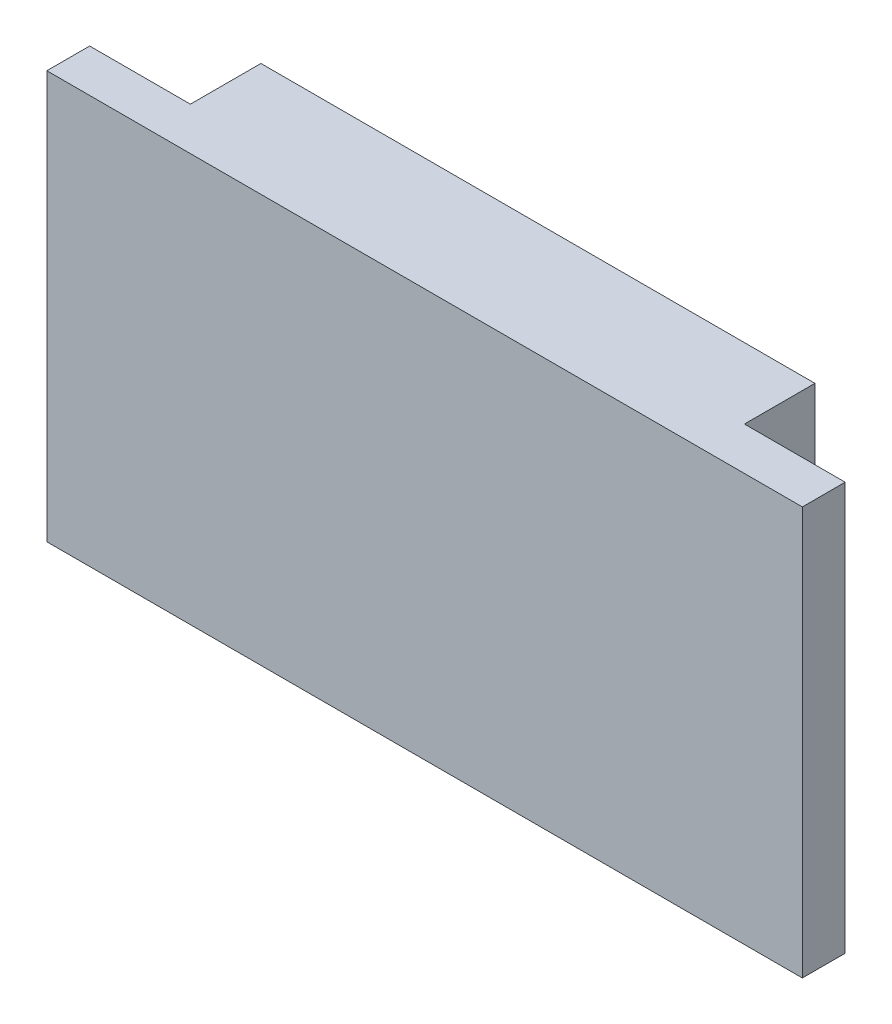
ISO-10303-21;
HEADER;
FILE_DESCRIPTION(('STEP AP214'),'2;1');
FILE_NAME('part.step','',(''),(''),'','','');
FILE_SCHEMA(('AUTOMOTIVE_DESIGN { 1 0 10303 214 1 1 1 1 }'));
ENDSEC;
DATA;
#1=APPLICATION_CONTEXT('core data for automotive mechanical design processes');
#2=APPLICATION_PROTOCOL_DEFINITION('international standard','automotive_design',2000,#1);
#3=PRODUCT_CONTEXT('',#1,'mechanical');
#4=PRODUCT('Part','Part','',(#3));
#5=PRODUCT_RELATED_PRODUCT_CATEGORY('part','',(#4));
#6=PRODUCT_DEFINITION_FORMATION('','',#4);
#7=PRODUCT_DEFINITION_CONTEXT('part definition',#1,'design');
#8=PRODUCT_DEFINITION('design','',#6,#7);
#9=PRODUCT_DEFINITION_SHAPE('','',#8);
#10=(LENGTH_UNIT() NAMED_UNIT(*) SI_UNIT(.MILLI.,.METRE.));
#11=(NAMED_UNIT(*) PLANE_ANGLE_UNIT() SI_UNIT($,.RADIAN.));
#12=(NAMED_UNIT(*) SI_UNIT($,.STERADIAN.) SOLID_ANGLE_UNIT());
#13=UNCERTAINTY_MEASURE_WITH_UNIT(LENGTH_MEASURE(1.E-05),#10,'distance_accuracy_value','');
#14=(GEOMETRIC_REPRESENTATION_CONTEXT(3) GLOBAL_UNCERTAINTY_ASSIGNED_CONTEXT((#13)) GLOBAL_UNIT_ASSIGNED_CONTEXT((#10,
#11,#12)) REPRESENTATION_CONTEXT('',''));
#15=CARTESIAN_POINT('',(0.,0.,0.));
#16=DIRECTION('',(0.,0.,1.));
#17=DIRECTION('',(1.,0.,0.));
#18=AXIS2_PLACEMENT_3D('',#15,#16,#17);
#19=CARTESIAN_POINT('',(-15.,-8.1,4.5));
#20=DIRECTION('',(-1.,0.,0.));
#21=DIRECTION('',(0.,0.,1.));
#22=AXIS2_PLACEMENT_3D('',#19,#20,#21);
#23=PLANE('',#22);
#24=DIRECTION('',(0.,0.,-1.));
#25=VECTOR('',#24,1.);
#26=CARTESIAN_POINT('',(-15.,8.1,4.5));
#27=LINE('',#26,#25);
#28=CARTESIAN_POINT('',(-15.,8.1,4.5));
#29=VERTEX_POINT('',#28);
#30=CARTESIAN_POINT('',(-15.,8.1,2.8));
#31=VERTEX_POINT('',#30);
#32=EDGE_CURVE('E47',#29,#31,#27,.T.);
#33=ORIENTED_EDGE('',*,*,#32,.T.);
#34=DIRECTION('',(0.,-1.,0.));
#35=VECTOR('',#34,1.);
#36=CARTESIAN_POINT('',(-15.,-8.1,2.8));
#37=LINE('',#36,#35);
#38=CARTESIAN_POINT('',(-15.,-8.1,2.8));
#39=VERTEX_POINT('',#38);
#40=EDGE_CURVE('E165',#31,#39,#37,.T.);
#41=ORIENTED_EDGE('',*,*,#40,.T.);
#42=DIRECTION('',(0.,0.,-1.));
#43=VECTOR('',#42,1.);
#44=CARTESIAN_POINT('',(-15.,-8.1,4.5));
#45=LINE('',#44,#43);
#46=CARTESIAN_POINT('',(-15.,-8.1,4.5));
#47=VERTEX_POINT('',#46);
#48=EDGE_CURVE('E13',#47,#39,#45,.T.);
#49=ORIENTED_EDGE('',*,*,#48,.F.);
#50=DIRECTION('',(0.,1.,0.));
#51=VECTOR('',#50,1.);
#52=CARTESIAN_POINT('',(-15.,-8.1,4.5));
#53=LINE('',#52,#51);
#54=EDGE_CURVE('E131',#47,#29,#53,.T.);
#55=ORIENTED_EDGE('',*,*,#54,.T.);
#56=EDGE_LOOP('',(#33,#41,#49,#55));
#57=FACE_BOUND('',#56,.T.);
#58=ADVANCED_FACE('F44',(#57),#23,.T.);
#59=CARTESIAN_POINT('',(15.,-8.1,4.5));
#60=DIRECTION('',(-1.,0.,0.));
#61=DIRECTION('',(0.,0.,1.));
#62=AXIS2_PLACEMENT_3D('',#59,#60,#61);
#63=PLANE('',#62);
#64=DIRECTION('',(0.,1.,0.));
#65=VECTOR('',#64,1.);
#66=CARTESIAN_POINT('',(15.,8.1,2.8));
#67=LINE('',#66,#65);
#68=CARTESIAN_POINT('',(15.,-8.1,2.8));
#69=VERTEX_POINT('',#68);
#70=CARTESIAN_POINT('',(15.,8.1,2.8));
#71=VERTEX_POINT('',#70);
#72=EDGE_CURVE('E134',#69,#71,#67,.T.);
#73=ORIENTED_EDGE('',*,*,#72,.T.);
#74=DIRECTION('',(0.,0.,-1.));
#75=VECTOR('',#74,1.);
#76=CARTESIAN_POINT('',(15.,8.1,4.5));
#77=LINE('',#76,#75);
#78=CARTESIAN_POINT('',(15.,8.1,4.5));
#79=VERTEX_POINT('',#78);
#80=EDGE_CURVE('E141',#79,#71,#77,.T.);
#81=ORIENTED_EDGE('',*,*,#80,.F.);
#82=DIRECTION('',(0.,1.,0.));
#83=VECTOR('',#82,1.);
#84=CARTESIAN_POINT('',(15.,-8.1,4.5));
#85=LINE('',#84,#83);
#86=CARTESIAN_POINT('',(15.,-8.1,4.5));
#87=VERTEX_POINT('',#86);
#88=EDGE_CURVE('E148',#87,#79,#85,.T.);
#89=ORIENTED_EDGE('',*,*,#88,.F.);
#90=DIRECTION('',(0.,0.,-1.));
#91=VECTOR('',#90,1.);
#92=CARTESIAN_POINT('',(15.,-8.1,4.5));
#93=LINE('',#92,#91);
#94=EDGE_CURVE('E52',#87,#69,#93,.T.);
#95=ORIENTED_EDGE('',*,*,#94,.T.);
#96=EDGE_LOOP('',(#73,#81,#89,#95));
#97=FACE_BOUND('',#96,.T.);
#98=ADVANCED_FACE('F190',(#97),#63,.F.);
#99=CARTESIAN_POINT('',(-15.,-8.1,4.5));
#100=DIRECTION('',(0.,1.,0.));
#101=DIRECTION('',(0.,0.,1.));
#102=AXIS2_PLACEMENT_3D('',#99,#100,#101);
#103=PLANE('',#102);
#104=DIRECTION('',(1.,0.,0.));
#105=VECTOR('',#104,1.);
#106=CARTESIAN_POINT('',(-15.,-8.1,0.));
#107=LINE('',#106,#105);
#108=CARTESIAN_POINT('',(-11.,-8.1,0.));
#109=VERTEX_POINT('',#108);
#110=CARTESIAN_POINT('',(11.,-8.1,0.));
#111=VERTEX_POINT('',#110);
#112=EDGE_CURVE('E128',#109,#111,#107,.T.);
#113=ORIENTED_EDGE('',*,*,#112,.T.);
#114=DIRECTION('',(0.,0.,-1.));
#115=VECTOR('',#114,1.);
#116=CARTESIAN_POINT('',(11.,-8.1,21.1865215068929));
#117=LINE('',#116,#115);
#118=CARTESIAN_POINT('',(11.,-8.1,2.8));
#119=VERTEX_POINT('',#118);
#120=EDGE_CURVE('E60',#119,#111,#117,.T.);
#121=ORIENTED_EDGE('',*,*,#120,.F.);
#122=DIRECTION('',(1.,0.,0.));
#123=VECTOR('',#122,1.);
#124=CARTESIAN_POINT('',(15.,-8.1,2.8));
#125=LINE('',#124,#123);
#126=EDGE_CURVE('E129',#119,#69,#125,.T.);
#127=ORIENTED_EDGE('',*,*,#126,.T.);
#128=ORIENTED_EDGE('',*,*,#94,.F.);
#129=DIRECTION('',(1.,0.,0.));
#130=VECTOR('',#129,1.);
#131=CARTESIAN_POINT('',(-15.,-8.1,4.5));
#132=LINE('',#131,#130);
#133=EDGE_CURVE('E137',#47,#87,#132,.T.);
#134=ORIENTED_EDGE('',*,*,#133,.F.);
#135=ORIENTED_EDGE('',*,*,#48,.T.);
#136=DIRECTION('',(1.,0.,0.));
#137=VECTOR('',#136,1.);
#138=CARTESIAN_POINT('',(-15.,-8.1,2.8));
#139=LINE('',#138,#137);
#140=CARTESIAN_POINT('',(-11.,-8.1,2.8));
#141=VERTEX_POINT('',#140);
#142=EDGE_CURVE('E162',#39,#141,#139,.T.);
#143=ORIENTED_EDGE('',*,*,#142,.T.);
#144=DIRECTION('',(0.,0.,-1.));
#145=VECTOR('',#144,1.);
#146=CARTESIAN_POINT('',(-11.,-8.1,21.1865215068929));
#147=LINE('',#146,#145);
#148=EDGE_CURVE('E161',#141,#109,#147,.T.);
#149=ORIENTED_EDGE('',*,*,#148,.T.);
#150=EDGE_LOOP('',(#113,#121,#127,#128,#134,#135,#143,#149));
#151=FACE_BOUND('',#150,.T.);
#152=ADVANCED_FACE('F182',(#151),#103,.F.);
#153=CARTESIAN_POINT('',(-15.,8.1,4.5));
#154=DIRECTION('',(0.,1.,0.));
#155=DIRECTION('',(0.,0.,1.));
#156=AXIS2_PLACEMENT_3D('',#153,#154,#155);
#157=PLANE('',#156);
#158=DIRECTION('',(0.,0.,-1.));
#159=VECTOR('',#158,1.);
#160=CARTESIAN_POINT('',(11.,8.1,21.1865215068929));
#161=LINE('',#160,#159);
#162=CARTESIAN_POINT('',(11.,8.1,2.8));
#163=VERTEX_POINT('',#162);
#164=CARTESIAN_POINT('',(11.,8.1,0.));
#165=VERTEX_POINT('',#164);
#166=EDGE_CURVE('E111',#163,#165,#161,.T.);
#167=ORIENTED_EDGE('',*,*,#166,.T.);
#168=DIRECTION('',(1.,0.,0.));
#169=VECTOR('',#168,1.);
#170=CARTESIAN_POINT('',(-15.,8.1,0.));
#171=LINE('',#170,#169);
#172=CARTESIAN_POINT('',(-11.,8.1,0.));
#173=VERTEX_POINT('',#172);
#174=EDGE_CURVE('E122',#173,#165,#171,.T.);
#175=ORIENTED_EDGE('',*,*,#174,.F.);
#176=DIRECTION('',(0.,0.,-1.));
#177=VECTOR('',#176,1.);
#178=CARTESIAN_POINT('',(-11.,8.1,21.1865215068929));
#179=LINE('',#178,#177);
#180=CARTESIAN_POINT('',(-11.,8.1,2.8));
#181=VERTEX_POINT('',#180);
#182=EDGE_CURVE('E68',#181,#173,#179,.T.);
#183=ORIENTED_EDGE('',*,*,#182,.F.);
#184=DIRECTION('',(-1.,0.,0.));
#185=VECTOR('',#184,1.);
#186=CARTESIAN_POINT('',(-15.,8.1,2.8));
#187=LINE('',#186,#185);
#188=EDGE_CURVE('E167',#181,#31,#187,.T.);
#189=ORIENTED_EDGE('',*,*,#188,.T.);
#190=ORIENTED_EDGE('',*,*,#32,.F.);
#191=DIRECTION('',(1.,0.,0.));
#192=VECTOR('',#191,1.);
#193=CARTESIAN_POINT('',(-15.,8.1,4.5));
#194=LINE('',#193,#192);
#195=EDGE_CURVE('E153',#29,#79,#194,.T.);
#196=ORIENTED_EDGE('',*,*,#195,.T.);
#197=ORIENTED_EDGE('',*,*,#80,.T.);
#198=DIRECTION('',(-1.,0.,0.));
#199=VECTOR('',#198,1.);
#200=CARTESIAN_POINT('',(15.,8.1,2.8));
#201=LINE('',#200,#199);
#202=EDGE_CURVE('E124',#71,#163,#201,.T.);
#203=ORIENTED_EDGE('',*,*,#202,.T.);
#204=EDGE_LOOP('',(#167,#175,#183,#189,#190,#196,#197,#203));
#205=FACE_BOUND('',#204,.T.);
#206=ADVANCED_FACE('F121',(#205),#157,.T.);
#207=CARTESIAN_POINT('',(0.,0.,4.5));
#208=DIRECTION('',(0.,0.,-1.));
#209=DIRECTION('',(-1.,0.,0.));
#210=AXIS2_PLACEMENT_3D('',#207,#208,#209);
#211=PLANE('',#210);
#212=ORIENTED_EDGE('',*,*,#54,.F.);
#213=ORIENTED_EDGE('',*,*,#133,.T.);
#214=ORIENTED_EDGE('',*,*,#88,.T.);
#215=ORIENTED_EDGE('',*,*,#195,.F.);
#216=EDGE_LOOP('',(#212,#213,#214,#215));
#217=FACE_BOUND('',#216,.T.);
#218=ADVANCED_FACE('F188',(#217),#211,.F.);
#219=CARTESIAN_POINT('',(0.,0.,0.));
#220=DIRECTION('',(0.,0.,-1.));
#221=DIRECTION('',(-1.,0.,0.));
#222=AXIS2_PLACEMENT_3D('',#219,#220,#221);
#223=PLANE('',#222);
#224=DIRECTION('',(0.,1.,0.));
#225=VECTOR('',#224,1.);
#226=CARTESIAN_POINT('',(11.,8.1,0.));
#227=LINE('',#226,#225);
#228=EDGE_CURVE('E108',#111,#165,#227,.T.);
#229=ORIENTED_EDGE('',*,*,#228,.F.);
#230=ORIENTED_EDGE('',*,*,#112,.F.);
#231=DIRECTION('',(0.,-1.,0.));
#232=VECTOR('',#231,1.);
#233=CARTESIAN_POINT('',(-11.,-8.1,0.));
#234=LINE('',#233,#232);
#235=EDGE_CURVE('E117',#173,#109,#234,.T.);
#236=ORIENTED_EDGE('',*,*,#235,.F.);
#237=ORIENTED_EDGE('',*,*,#174,.T.);
#238=EDGE_LOOP('',(#229,#230,#236,#237));
#239=FACE_BOUND('',#238,.T.);
#240=ADVANCED_FACE('F127',(#239),#223,.T.);
#241=CARTESIAN_POINT('',(-11.,-8.1,21.1865215068929));
#242=DIRECTION('',(1.,0.,0.));
#243=DIRECTION('',(0.,1.,0.));
#244=AXIS2_PLACEMENT_3D('',#241,#242,#243);
#245=PLANE('',#244);
#246=DIRECTION('',(0.,1.,0.));
#247=VECTOR('',#246,1.);
#248=CARTESIAN_POINT('',(-11.,-8.1,2.8));
#249=LINE('',#248,#247);
#250=EDGE_CURVE('E159',#141,#181,#249,.T.);
#251=ORIENTED_EDGE('',*,*,#250,.T.);
#252=ORIENTED_EDGE('',*,*,#182,.T.);
#253=ORIENTED_EDGE('',*,*,#235,.T.);
#254=ORIENTED_EDGE('',*,*,#148,.F.);
#255=EDGE_LOOP('',(#251,#252,#253,#254));
#256=FACE_BOUND('',#255,.T.);
#257=ADVANCED_FACE('F184',(#256),#245,.F.);
#258=CARTESIAN_POINT('',(0.,0.,2.8));
#259=DIRECTION('',(0.,0.,-1.));
#260=DIRECTION('',(-1.,0.,0.));
#261=AXIS2_PLACEMENT_3D('',#258,#259,#260);
#262=PLANE('',#261);
#263=ORIENTED_EDGE('',*,*,#40,.F.);
#264=ORIENTED_EDGE('',*,*,#188,.F.);
#265=ORIENTED_EDGE('',*,*,#250,.F.);
#266=ORIENTED_EDGE('',*,*,#142,.F.);
#267=EDGE_LOOP('',(#263,#264,#265,#266));
#268=FACE_BOUND('',#267,.T.);
#269=ADVANCED_FACE('F187',(#268),#262,.T.);
#270=CARTESIAN_POINT('',(11.,8.1,21.1865215068929));
#271=DIRECTION('',(-1.,0.,0.));
#272=DIRECTION('',(0.,-1.,0.));
#273=AXIS2_PLACEMENT_3D('',#270,#271,#272);
#274=PLANE('',#273);
#275=DIRECTION('',(0.,-1.,0.));
#276=VECTOR('',#275,1.);
#277=CARTESIAN_POINT('',(11.,8.1,2.8));
#278=LINE('',#277,#276);
#279=EDGE_CURVE('E125',#163,#119,#278,.T.);
#280=ORIENTED_EDGE('',*,*,#279,.T.);
#281=ORIENTED_EDGE('',*,*,#120,.T.);
#282=ORIENTED_EDGE('',*,*,#228,.T.);
#283=ORIENTED_EDGE('',*,*,#166,.F.);
#284=EDGE_LOOP('',(#280,#281,#282,#283));
#285=FACE_BOUND('',#284,.T.);
#286=ADVANCED_FACE('F110',(#285),#274,.F.);
#287=CARTESIAN_POINT('',(0.,0.,2.8));
#288=DIRECTION('',(0.,0.,-1.));
#289=DIRECTION('',(-1.,0.,0.));
#290=AXIS2_PLACEMENT_3D('',#287,#288,#289);
#291=PLANE('',#290);
#292=ORIENTED_EDGE('',*,*,#72,.F.);
#293=ORIENTED_EDGE('',*,*,#126,.F.);
#294=ORIENTED_EDGE('',*,*,#279,.F.);
#295=ORIENTED_EDGE('',*,*,#202,.F.);
#296=EDGE_LOOP('',(#292,#293,#294,#295));
#297=FACE_BOUND('',#296,.T.);
#298=ADVANCED_FACE('F180',(#297),#291,.T.);
#299=CLOSED_SHELL('',(#58,#98,#152,#206,#218,#240,#257,#269,#286,#298));
#300=MANIFOLD_SOLID_BREP('B2',#299);
#301=ADVANCED_BREP_SHAPE_REPRESENTATION('',(#18,#300),#14);
#302=SHAPE_DEFINITION_REPRESENTATION(#9,#301);
ENDSEC;
END-ISO-10303-21;
